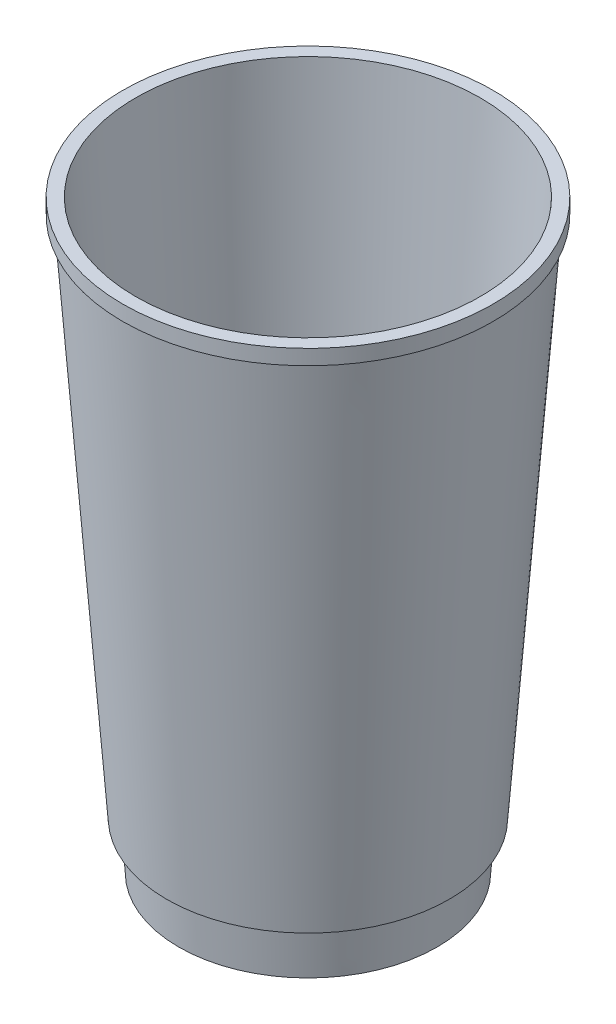
ISO-10303-21;
HEADER;
FILE_DESCRIPTION(('STEP AP214'),'2;1');
FILE_NAME('part.step','',(''),(''),'','','');
FILE_SCHEMA(('AUTOMOTIVE_DESIGN { 1 0 10303 214 1 1 1 1 }'));
ENDSEC;
DATA;
#1=APPLICATION_CONTEXT('core data for automotive mechanical design processes');
#2=APPLICATION_PROTOCOL_DEFINITION('international standard','automotive_design',2000,#1);
#3=PRODUCT_CONTEXT('',#1,'mechanical');
#4=PRODUCT('Part','Part','',(#3));
#5=PRODUCT_RELATED_PRODUCT_CATEGORY('part','',(#4));
#6=PRODUCT_DEFINITION_FORMATION('','',#4);
#7=PRODUCT_DEFINITION_CONTEXT('part definition',#1,'design');
#8=PRODUCT_DEFINITION('design','',#6,#7);
#9=PRODUCT_DEFINITION_SHAPE('','',#8);
#10=(LENGTH_UNIT() NAMED_UNIT(*) SI_UNIT(.MILLI.,.METRE.));
#11=(NAMED_UNIT(*) PLANE_ANGLE_UNIT() SI_UNIT($,.RADIAN.));
#12=(NAMED_UNIT(*) SI_UNIT($,.STERADIAN.) SOLID_ANGLE_UNIT());
#13=UNCERTAINTY_MEASURE_WITH_UNIT(LENGTH_MEASURE(1.E-05),#10,'distance_accuracy_value','');
#14=(GEOMETRIC_REPRESENTATION_CONTEXT(3) GLOBAL_UNCERTAINTY_ASSIGNED_CONTEXT((#13)) GLOBAL_UNIT_ASSIGNED_CONTEXT((#10,
#11,#12)) REPRESENTATION_CONTEXT('',''));
#15=CARTESIAN_POINT('',(0.,0.,0.));
#16=DIRECTION('',(0.,0.,1.));
#17=DIRECTION('',(1.,0.,0.));
#18=AXIS2_PLACEMENT_3D('',#15,#16,#17);
#19=CARTESIAN_POINT('',(0.,135.8,0.));
#20=DIRECTION('',(0.,1.,0.));
#21=DIRECTION('',(0.,0.,1.));
#22=AXIS2_PLACEMENT_3D('',#19,#20,#21);
#23=PLANE('',#22);
#24=CARTESIAN_POINT('',(0.,135.8,0.));
#25=DIRECTION('',(0.,1.,0.));
#26=DIRECTION('',(0.,0.,1.));
#27=AXIS2_PLACEMENT_3D('',#24,#25,#26);
#28=CIRCLE('',#27,40.);
#29=CARTESIAN_POINT('',(0.,135.8,40.));
#30=VERTEX_POINT('',#29);
#31=EDGE_CURVE('E179',#30,#30,#28,.T.);
#32=ORIENTED_EDGE('',*,*,#31,.F.);
#33=EDGE_LOOP('',(#32));
#34=FACE_BOUND('',#33,.T.);
#35=CARTESIAN_POINT('',(0.,135.8,0.));
#36=DIRECTION('',(0.,1.,0.));
#37=DIRECTION('',(0.,0.,1.));
#38=AXIS2_PLACEMENT_3D('',#35,#36,#37);
#39=CIRCLE('',#38,43.);
#40=CARTESIAN_POINT('',(0.,135.8,43.));
#41=VERTEX_POINT('',#40);
#42=EDGE_CURVE('E11',#41,#41,#39,.T.);
#43=ORIENTED_EDGE('',*,*,#42,.T.);
#44=EDGE_LOOP('',(#43));
#45=FACE_BOUND('',#44,.T.);
#46=ADVANCED_FACE('F46',(#34,#45),#23,.T.);
#47=CARTESIAN_POINT('',(0.,132.3,0.));
#48=DIRECTION('',(0.,1.,0.));
#49=DIRECTION('',(0.,0.,1.));
#50=AXIS2_PLACEMENT_3D('',#47,#48,#49);
#51=PLANE('',#50);
#52=CARTESIAN_POINT('',(0.,132.3,0.));
#53=DIRECTION('',(0.,1.,0.));
#54=DIRECTION('',(0.,0.,1.));
#55=AXIS2_PLACEMENT_3D('',#52,#53,#54);
#56=CIRCLE('',#55,41.75);
#57=CARTESIAN_POINT('',(0.,132.3,41.75));
#58=VERTEX_POINT('',#57);
#59=EDGE_CURVE('E59',#58,#58,#56,.T.);
#60=ORIENTED_EDGE('',*,*,#59,.T.);
#61=EDGE_LOOP('',(#60));
#62=FACE_BOUND('',#61,.T.);
#63=CARTESIAN_POINT('',(0.,132.3,0.));
#64=DIRECTION('',(0.,1.,0.));
#65=DIRECTION('',(0.,0.,1.));
#66=AXIS2_PLACEMENT_3D('',#63,#64,#65);
#67=CIRCLE('',#66,43.);
#68=CARTESIAN_POINT('',(0.,132.3,43.));
#69=VERTEX_POINT('',#68);
#70=EDGE_CURVE('E54',#69,#69,#67,.T.);
#71=ORIENTED_EDGE('',*,*,#70,.F.);
#72=EDGE_LOOP('',(#71));
#73=FACE_BOUND('',#72,.T.);
#74=ADVANCED_FACE('F78',(#62,#73),#51,.F.);
#75=CARTESIAN_POINT('',(0.,132.3,0.));
#76=DIRECTION('',(0.,1.,0.));
#77=DIRECTION('',(0.,0.,1.));
#78=AXIS2_PLACEMENT_3D('',#75,#76,#77);
#79=CYLINDRICAL_SURFACE('',#78,43.);
#80=ORIENTED_EDGE('',*,*,#42,.F.);
#81=EDGE_LOOP('',(#80));
#82=FACE_BOUND('',#81,.T.);
#83=ORIENTED_EDGE('',*,*,#70,.T.);
#84=EDGE_LOOP('',(#83));
#85=FACE_BOUND('',#84,.T.);
#86=ADVANCED_FACE('F87',(#82,#85),#79,.T.);
#87=CARTESIAN_POINT('',(0.,11.,0.));
#88=DIRECTION('',(0.,1.,0.));
#89=DIRECTION('',(0.,0.,1.));
#90=AXIS2_PLACEMENT_3D('',#87,#88,#89);
#91=PLANE('',#90);
#92=CARTESIAN_POINT('',(0.,11.,0.));
#93=DIRECTION('',(0.,1.,0.));
#94=DIRECTION('',(0.,0.,1.));
#95=AXIS2_PLACEMENT_3D('',#92,#93,#94);
#96=CIRCLE('',#95,30.775);
#97=CARTESIAN_POINT('',(0.,11.,30.775));
#98=VERTEX_POINT('',#97);
#99=EDGE_CURVE('E156',#98,#98,#96,.T.);
#100=ORIENTED_EDGE('',*,*,#99,.T.);
#101=EDGE_LOOP('',(#100));
#102=FACE_BOUND('',#101,.T.);
#103=CARTESIAN_POINT('',(0.,11.,0.));
#104=DIRECTION('',(0.,1.,0.));
#105=DIRECTION('',(0.,0.,1.));
#106=AXIS2_PLACEMENT_3D('',#103,#104,#105);
#107=CIRCLE('',#106,32.8);
#108=CARTESIAN_POINT('',(0.,11.,32.8));
#109=VERTEX_POINT('',#108);
#110=EDGE_CURVE('E114',#109,#109,#107,.T.);
#111=ORIENTED_EDGE('',*,*,#110,.F.);
#112=EDGE_LOOP('',(#111));
#113=FACE_BOUND('',#112,.T.);
#114=ADVANCED_FACE('F94',(#102,#113),#91,.F.);
#115=CARTESIAN_POINT('',(0.,11.,0.));
#116=DIRECTION('',(0.,1.,0.));
#117=DIRECTION('',(0.,0.,1.));
#118=AXIS2_PLACEMENT_3D('',#115,#116,#117);
#119=CONICAL_SURFACE('',#118,32.8,0.0736505469280148);
#120=ORIENTED_EDGE('',*,*,#110,.T.);
#121=EDGE_LOOP('',(#120));
#122=FACE_BOUND('',#121,.T.);
#123=ORIENTED_EDGE('',*,*,#59,.F.);
#124=EDGE_LOOP('',(#123));
#125=FACE_BOUND('',#124,.T.);
#126=ADVANCED_FACE('F89',(#122,#125),#119,.T.);
#127=CARTESIAN_POINT('',(0.,0.,0.));
#128=DIRECTION('',(0.,1.,0.));
#129=DIRECTION('',(0.,0.,1.));
#130=AXIS2_PLACEMENT_3D('',#127,#128,#129);
#131=PLANE('',#130);
#132=CARTESIAN_POINT('',(0.,0.,0.));
#133=DIRECTION('',(0.,1.,0.));
#134=DIRECTION('',(0.,0.,1.));
#135=AXIS2_PLACEMENT_3D('',#132,#133,#134);
#136=CIRCLE('',#135,29.);
#137=CARTESIAN_POINT('',(0.,0.,29.));
#138=VERTEX_POINT('',#137);
#139=EDGE_CURVE('E184',#138,#138,#136,.T.);
#140=ORIENTED_EDGE('',*,*,#139,.T.);
#141=EDGE_LOOP('',(#140));
#142=FACE_BOUND('',#141,.T.);
#143=CARTESIAN_POINT('',(0.,0.,0.));
#144=DIRECTION('',(0.,1.,0.));
#145=DIRECTION('',(0.,0.,1.));
#146=AXIS2_PLACEMENT_3D('',#143,#144,#145);
#147=CIRCLE('',#146,30.);
#148=CARTESIAN_POINT('',(0.,0.,30.));
#149=VERTEX_POINT('',#148);
#150=EDGE_CURVE('E119',#149,#149,#147,.T.);
#151=ORIENTED_EDGE('',*,*,#150,.F.);
#152=EDGE_LOOP('',(#151));
#153=FACE_BOUND('',#152,.T.);
#154=ADVANCED_FACE('F134',(#142,#153),#131,.F.);
#155=CARTESIAN_POINT('',(0.,0.,0.));
#156=DIRECTION('',(0.,1.,0.));
#157=DIRECTION('',(0.,0.,1.));
#158=AXIS2_PLACEMENT_3D('',#155,#156,#157);
#159=CONICAL_SURFACE('',#158,30.,0.0703383163243791);
#160=ORIENTED_EDGE('',*,*,#99,.F.);
#161=EDGE_LOOP('',(#160));
#162=FACE_BOUND('',#161,.T.);
#163=ORIENTED_EDGE('',*,*,#150,.T.);
#164=EDGE_LOOP('',(#163));
#165=FACE_BOUND('',#164,.T.);
#166=ADVANCED_FACE('F138',(#162,#165),#159,.T.);
#167=CARTESIAN_POINT('',(0.,11.,0.));
#168=DIRECTION('',(0.,1.,0.));
#169=DIRECTION('',(0.,0.,1.));
#170=AXIS2_PLACEMENT_3D('',#167,#168,#169);
#171=PLANE('',#170);
#172=CARTESIAN_POINT('',(0.,11.,0.));
#173=DIRECTION('',(0.,1.,0.));
#174=DIRECTION('',(0.,0.,1.));
#175=AXIS2_PLACEMENT_3D('',#172,#173,#174);
#176=CIRCLE('',#175,29.775);
#177=CARTESIAN_POINT('',(0.,11.,29.775));
#178=VERTEX_POINT('',#177);
#179=EDGE_CURVE('E229',#178,#178,#176,.T.);
#180=ORIENTED_EDGE('',*,*,#179,.F.);
#181=EDGE_LOOP('',(#180));
#182=FACE_BOUND('',#181,.T.);
#183=ADVANCED_FACE('F213',(#182),#171,.F.);
#184=CARTESIAN_POINT('',(0.,0.,0.));
#185=DIRECTION('',(0.,1.,0.));
#186=DIRECTION('',(0.,0.,1.));
#187=AXIS2_PLACEMENT_3D('',#184,#185,#186);
#188=CONICAL_SURFACE('',#187,29.,0.0703383163243791);
#189=ORIENTED_EDGE('',*,*,#139,.F.);
#190=EDGE_LOOP('',(#189));
#191=FACE_BOUND('',#190,.T.);
#192=ORIENTED_EDGE('',*,*,#179,.T.);
#193=EDGE_LOOP('',(#192));
#194=FACE_BOUND('',#193,.T.);
#195=ADVANCED_FACE('F209',(#191,#194),#188,.F.);
#196=CARTESIAN_POINT('',(0.,12.,0.));
#197=DIRECTION('',(0.,1.,0.));
#198=DIRECTION('',(0.,0.,1.));
#199=AXIS2_PLACEMENT_3D('',#196,#197,#198);
#200=PLANE('',#199);
#201=CARTESIAN_POINT('',(0.,12.,0.));
#202=DIRECTION('',(0.,1.,0.));
#203=DIRECTION('',(0.,0.,1.));
#204=AXIS2_PLACEMENT_3D('',#201,#202,#203);
#205=CIRCLE('',#204,31.8);
#206=CARTESIAN_POINT('',(0.,12.,31.8));
#207=VERTEX_POINT('',#206);
#208=EDGE_CURVE('E181',#207,#207,#205,.T.);
#209=ORIENTED_EDGE('',*,*,#208,.T.);
#210=EDGE_LOOP('',(#209));
#211=FACE_BOUND('',#210,.T.);
#212=ADVANCED_FACE('F199',(#211),#200,.T.);
#213=CARTESIAN_POINT('',(0.,12.,0.));
#214=DIRECTION('',(0.,1.,0.));
#215=DIRECTION('',(0.,0.,1.));
#216=AXIS2_PLACEMENT_3D('',#213,#214,#215);
#217=CONICAL_SURFACE('',#216,31.8,0.0661392553740743);
#218=ORIENTED_EDGE('',*,*,#31,.T.);
#219=EDGE_LOOP('',(#218));
#220=FACE_BOUND('',#219,.T.);
#221=ORIENTED_EDGE('',*,*,#208,.F.);
#222=EDGE_LOOP('',(#221));
#223=FACE_BOUND('',#222,.T.);
#224=ADVANCED_FACE('F208',(#220,#223),#217,.F.);
#225=CLOSED_SHELL('',(#46,#74,#86,#114,#126,#154,#166,#183,#195,#212,#224));
#226=MANIFOLD_SOLID_BREP('B2',#225);
#227=ADVANCED_BREP_SHAPE_REPRESENTATION('',(#18,#226),#14);
#228=SHAPE_DEFINITION_REPRESENTATION(#9,#227);
ENDSEC;
END-ISO-10303-21;
